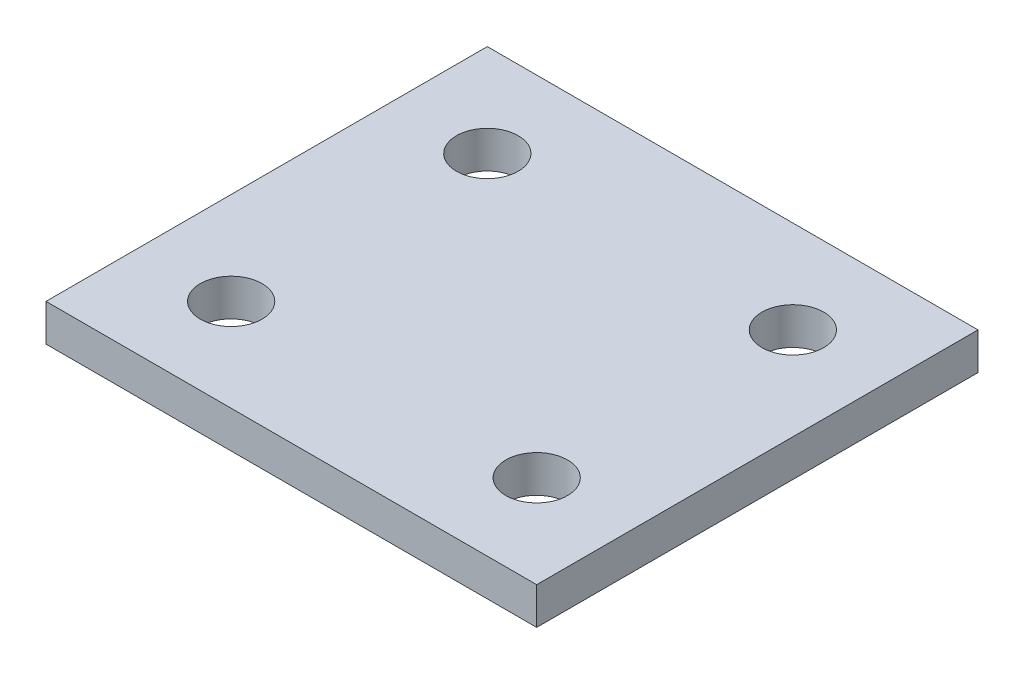
ISO-10303-21;
HEADER;
FILE_DESCRIPTION(('STEP AP214'),'2;1');
FILE_NAME('part.step','',(''),(''),'','','');
FILE_SCHEMA(('AUTOMOTIVE_DESIGN { 1 0 10303 214 1 1 1 1 }'));
ENDSEC;
DATA;
#1=APPLICATION_CONTEXT('core data for automotive mechanical design processes');
#2=APPLICATION_PROTOCOL_DEFINITION('international standard','automotive_design',2000,#1);
#3=PRODUCT_CONTEXT('',#1,'mechanical');
#4=PRODUCT('Part','Part','',(#3));
#5=PRODUCT_RELATED_PRODUCT_CATEGORY('part','',(#4));
#6=PRODUCT_DEFINITION_FORMATION('','',#4);
#7=PRODUCT_DEFINITION_CONTEXT('part definition',#1,'design');
#8=PRODUCT_DEFINITION('design','',#6,#7);
#9=PRODUCT_DEFINITION_SHAPE('','',#8);
#10=(LENGTH_UNIT() NAMED_UNIT(*) SI_UNIT(.MILLI.,.METRE.));
#11=(NAMED_UNIT(*) PLANE_ANGLE_UNIT() SI_UNIT($,.RADIAN.));
#12=(NAMED_UNIT(*) SI_UNIT($,.STERADIAN.) SOLID_ANGLE_UNIT());
#13=UNCERTAINTY_MEASURE_WITH_UNIT(LENGTH_MEASURE(1.E-05),#10,'distance_accuracy_value','');
#14=(GEOMETRIC_REPRESENTATION_CONTEXT(3) GLOBAL_UNCERTAINTY_ASSIGNED_CONTEXT((#13)) GLOBAL_UNIT_ASSIGNED_CONTEXT((#10,
#11,#12)) REPRESENTATION_CONTEXT('',''));
#15=CARTESIAN_POINT('',(0.,0.,0.));
#16=DIRECTION('',(0.,0.,1.));
#17=DIRECTION('',(1.,0.,0.));
#18=AXIS2_PLACEMENT_3D('',#15,#16,#17);
#19=CARTESIAN_POINT('',(0.,1.2,0.));
#20=DIRECTION('',(0.,-1.,0.));
#21=DIRECTION('',(0.,0.,-1.));
#22=AXIS2_PLACEMENT_3D('',#19,#20,#21);
#23=PLANE('',#22);
#24=CARTESIAN_POINT('',(12.9000000000001,1.2,11.3));
#25=DIRECTION('',(0.,1.,0.));
#26=DIRECTION('',(0.,0.,1.));
#27=AXIS2_PLACEMENT_3D('',#24,#25,#26);
#28=CIRCLE('',#27,0.999999999999998);
#29=CARTESIAN_POINT('',(12.9000000000001,1.2,12.3));
#30=VERTEX_POINT('',#29);
#31=EDGE_CURVE('E121',#30,#30,#28,.T.);
#32=ORIENTED_EDGE('',*,*,#31,.F.);
#33=EDGE_LOOP('',(#32));
#34=FACE_BOUND('',#33,.T.);
#35=CARTESIAN_POINT('',(3.,1.2,3.));
#36=DIRECTION('',(0.,1.,0.));
#37=DIRECTION('',(0.,0.,1.));
#38=AXIS2_PLACEMENT_3D('',#35,#36,#37);
#39=CIRCLE('',#38,1.);
#40=CARTESIAN_POINT('',(3.,1.2,4.));
#41=VERTEX_POINT('',#40);
#42=EDGE_CURVE('E100',#41,#41,#39,.T.);
#43=ORIENTED_EDGE('',*,*,#42,.F.);
#44=EDGE_LOOP('',(#43));
#45=FACE_BOUND('',#44,.T.);
#46=DIRECTION('',(0.,0.,1.));
#47=VECTOR('',#46,1.);
#48=CARTESIAN_POINT('',(0.,1.2,14.3));
#49=LINE('',#48,#47);
#50=CARTESIAN_POINT('',(0.,1.2,0.));
#51=VERTEX_POINT('',#50);
#52=CARTESIAN_POINT('',(0.,1.2,14.3));
#53=VERTEX_POINT('',#52);
#54=EDGE_CURVE('E85',#51,#53,#49,.T.);
#55=ORIENTED_EDGE('',*,*,#54,.T.);
#56=DIRECTION('',(1.,0.,0.));
#57=VECTOR('',#56,1.);
#58=CARTESIAN_POINT('',(15.9,1.2,14.3));
#59=LINE('',#58,#57);
#60=CARTESIAN_POINT('',(15.9,1.2,14.3));
#61=VERTEX_POINT('',#60);
#62=EDGE_CURVE('E80',#53,#61,#59,.T.);
#63=ORIENTED_EDGE('',*,*,#62,.T.);
#64=DIRECTION('',(0.,0.,-1.));
#65=VECTOR('',#64,1.);
#66=CARTESIAN_POINT('',(15.9,1.2,0.));
#67=LINE('',#66,#65);
#68=CARTESIAN_POINT('',(15.9,1.2,0.));
#69=VERTEX_POINT('',#68);
#70=EDGE_CURVE('E83',#61,#69,#67,.T.);
#71=ORIENTED_EDGE('',*,*,#70,.T.);
#72=DIRECTION('',(-1.,0.,0.));
#73=VECTOR('',#72,1.);
#74=CARTESIAN_POINT('',(0.,1.2,0.));
#75=LINE('',#74,#73);
#76=EDGE_CURVE('E50',#69,#51,#75,.T.);
#77=ORIENTED_EDGE('',*,*,#76,.T.);
#78=EDGE_LOOP('',(#55,#63,#71,#77));
#79=FACE_BOUND('',#78,.T.);
#80=CARTESIAN_POINT('',(12.9,1.2,3.));
#81=DIRECTION('',(0.,1.,0.));
#82=DIRECTION('',(0.,0.,1.));
#83=AXIS2_PLACEMENT_3D('',#80,#81,#82);
#84=CIRCLE('',#83,0.999999999999998);
#85=CARTESIAN_POINT('',(12.9,1.2,4.));
#86=VERTEX_POINT('',#85);
#87=EDGE_CURVE('E115',#86,#86,#84,.T.);
#88=ORIENTED_EDGE('',*,*,#87,.F.);
#89=EDGE_LOOP('',(#88));
#90=FACE_BOUND('',#89,.T.);
#91=CARTESIAN_POINT('',(3.00000000000009,1.2,11.3));
#92=DIRECTION('',(0.,1.,0.));
#93=DIRECTION('',(0.,0.,1.));
#94=AXIS2_PLACEMENT_3D('',#91,#92,#93);
#95=CIRCLE('',#94,1.);
#96=CARTESIAN_POINT('',(3.00000000000009,1.2,12.3));
#97=VERTEX_POINT('',#96);
#98=EDGE_CURVE('E127',#97,#97,#95,.T.);
#99=ORIENTED_EDGE('',*,*,#98,.F.);
#100=EDGE_LOOP('',(#99));
#101=FACE_BOUND('',#100,.T.);
#102=ADVANCED_FACE('F33',(#34,#45,#79,#90,#101),#23,.F.);
#103=CARTESIAN_POINT('',(0.,0.,0.));
#104=DIRECTION('',(0.,-1.,0.));
#105=DIRECTION('',(0.,0.,-1.));
#106=AXIS2_PLACEMENT_3D('',#103,#104,#105);
#107=PLANE('',#106);
#108=CARTESIAN_POINT('',(12.9000000000001,0.,11.3));
#109=DIRECTION('',(0.,1.,0.));
#110=DIRECTION('',(0.,0.,1.));
#111=AXIS2_PLACEMENT_3D('',#108,#109,#110);
#112=CIRCLE('',#111,0.999999999999998);
#113=CARTESIAN_POINT('',(12.9000000000001,0.,12.3));
#114=VERTEX_POINT('',#113);
#115=EDGE_CURVE('E124',#114,#114,#112,.T.);
#116=ORIENTED_EDGE('',*,*,#115,.T.);
#117=EDGE_LOOP('',(#116));
#118=FACE_BOUND('',#117,.T.);
#119=CARTESIAN_POINT('',(3.,0.,3.));
#120=DIRECTION('',(0.,1.,0.));
#121=DIRECTION('',(0.,0.,1.));
#122=AXIS2_PLACEMENT_3D('',#119,#120,#121);
#123=CIRCLE('',#122,1.);
#124=CARTESIAN_POINT('',(3.,0.,4.));
#125=VERTEX_POINT('',#124);
#126=EDGE_CURVE('E112',#125,#125,#123,.T.);
#127=ORIENTED_EDGE('',*,*,#126,.T.);
#128=EDGE_LOOP('',(#127));
#129=FACE_BOUND('',#128,.T.);
#130=DIRECTION('',(0.,0.,1.));
#131=VECTOR('',#130,1.);
#132=CARTESIAN_POINT('',(0.,0.,14.3));
#133=LINE('',#132,#131);
#134=CARTESIAN_POINT('',(0.,0.,0.));
#135=VERTEX_POINT('',#134);
#136=CARTESIAN_POINT('',(0.,0.,14.3));
#137=VERTEX_POINT('',#136);
#138=EDGE_CURVE('E97',#135,#137,#133,.T.);
#139=ORIENTED_EDGE('',*,*,#138,.F.);
#140=DIRECTION('',(-1.,0.,0.));
#141=VECTOR('',#140,1.);
#142=CARTESIAN_POINT('',(0.,0.,0.));
#143=LINE('',#142,#141);
#144=CARTESIAN_POINT('',(15.9,0.,0.));
#145=VERTEX_POINT('',#144);
#146=EDGE_CURVE('E73',#145,#135,#143,.T.);
#147=ORIENTED_EDGE('',*,*,#146,.F.);
#148=DIRECTION('',(0.,0.,-1.));
#149=VECTOR('',#148,1.);
#150=CARTESIAN_POINT('',(15.9,0.,0.));
#151=LINE('',#150,#149);
#152=CARTESIAN_POINT('',(15.9,0.,14.3));
#153=VERTEX_POINT('',#152);
#154=EDGE_CURVE('E67',#153,#145,#151,.T.);
#155=ORIENTED_EDGE('',*,*,#154,.F.);
#156=DIRECTION('',(1.,0.,0.));
#157=VECTOR('',#156,1.);
#158=CARTESIAN_POINT('',(15.9,0.,14.3));
#159=LINE('',#158,#157);
#160=EDGE_CURVE('E89',#137,#153,#159,.T.);
#161=ORIENTED_EDGE('',*,*,#160,.F.);
#162=EDGE_LOOP('',(#139,#147,#155,#161));
#163=FACE_BOUND('',#162,.T.);
#164=CARTESIAN_POINT('',(12.9,0.,3.));
#165=DIRECTION('',(0.,1.,0.));
#166=DIRECTION('',(0.,0.,1.));
#167=AXIS2_PLACEMENT_3D('',#164,#165,#166);
#168=CIRCLE('',#167,0.999999999999998);
#169=CARTESIAN_POINT('',(12.9,0.,4.));
#170=VERTEX_POINT('',#169);
#171=EDGE_CURVE('E118',#170,#170,#168,.T.);
#172=ORIENTED_EDGE('',*,*,#171,.T.);
#173=EDGE_LOOP('',(#172));
#174=FACE_BOUND('',#173,.T.);
#175=CARTESIAN_POINT('',(3.00000000000009,0.,11.3));
#176=DIRECTION('',(0.,1.,0.));
#177=DIRECTION('',(0.,0.,1.));
#178=AXIS2_PLACEMENT_3D('',#175,#176,#177);
#179=CIRCLE('',#178,1.);
#180=CARTESIAN_POINT('',(3.00000000000009,0.,12.3));
#181=VERTEX_POINT('',#180);
#182=EDGE_CURVE('E130',#181,#181,#179,.T.);
#183=ORIENTED_EDGE('',*,*,#182,.T.);
#184=EDGE_LOOP('',(#183));
#185=FACE_BOUND('',#184,.T.);
#186=ADVANCED_FACE('F108',(#118,#129,#163,#174,#185),#107,.T.);
#187=CARTESIAN_POINT('',(0.,1.2,14.3));
#188=DIRECTION('',(1.,0.,0.));
#189=DIRECTION('',(0.,0.,-1.));
#190=AXIS2_PLACEMENT_3D('',#187,#188,#189);
#191=PLANE('',#190);
#192=ORIENTED_EDGE('',*,*,#138,.T.);
#193=DIRECTION('',(0.,-1.,0.));
#194=VECTOR('',#193,1.);
#195=CARTESIAN_POINT('',(0.,1.2,14.3));
#196=LINE('',#195,#194);
#197=EDGE_CURVE('E11',#53,#137,#196,.T.);
#198=ORIENTED_EDGE('',*,*,#197,.F.);
#199=ORIENTED_EDGE('',*,*,#54,.F.);
#200=DIRECTION('',(0.,-1.,0.));
#201=VECTOR('',#200,1.);
#202=CARTESIAN_POINT('',(0.,1.2,0.));
#203=LINE('',#202,#201);
#204=EDGE_CURVE('E93',#51,#135,#203,.T.);
#205=ORIENTED_EDGE('',*,*,#204,.T.);
#206=EDGE_LOOP('',(#192,#198,#199,#205));
#207=FACE_BOUND('',#206,.T.);
#208=ADVANCED_FACE('F35',(#207),#191,.F.);
#209=CARTESIAN_POINT('',(15.9,1.2,14.3));
#210=DIRECTION('',(0.,0.,-1.));
#211=DIRECTION('',(-1.,0.,0.));
#212=AXIS2_PLACEMENT_3D('',#209,#210,#211);
#213=PLANE('',#212);
#214=ORIENTED_EDGE('',*,*,#160,.T.);
#215=DIRECTION('',(0.,-1.,0.));
#216=VECTOR('',#215,1.);
#217=CARTESIAN_POINT('',(15.9,1.2,14.3));
#218=LINE('',#217,#216);
#219=EDGE_CURVE('E42',#61,#153,#218,.T.);
#220=ORIENTED_EDGE('',*,*,#219,.F.);
#221=ORIENTED_EDGE('',*,*,#62,.F.);
#222=ORIENTED_EDGE('',*,*,#197,.T.);
#223=EDGE_LOOP('',(#214,#220,#221,#222));
#224=FACE_BOUND('',#223,.T.);
#225=ADVANCED_FACE('F88',(#224),#213,.F.);
#226=CARTESIAN_POINT('',(15.9,1.2,0.));
#227=DIRECTION('',(-1.,0.,0.));
#228=DIRECTION('',(0.,0.,1.));
#229=AXIS2_PLACEMENT_3D('',#226,#227,#228);
#230=PLANE('',#229);
#231=ORIENTED_EDGE('',*,*,#154,.T.);
#232=DIRECTION('',(0.,-1.,0.));
#233=VECTOR('',#232,1.);
#234=CARTESIAN_POINT('',(15.9,1.2,0.));
#235=LINE('',#234,#233);
#236=EDGE_CURVE('E90',#69,#145,#235,.T.);
#237=ORIENTED_EDGE('',*,*,#236,.F.);
#238=ORIENTED_EDGE('',*,*,#70,.F.);
#239=ORIENTED_EDGE('',*,*,#219,.T.);
#240=EDGE_LOOP('',(#231,#237,#238,#239));
#241=FACE_BOUND('',#240,.T.);
#242=ADVANCED_FACE('F91',(#241),#230,.F.);
#243=CARTESIAN_POINT('',(0.,1.2,0.));
#244=DIRECTION('',(0.,0.,1.));
#245=DIRECTION('',(1.,0.,0.));
#246=AXIS2_PLACEMENT_3D('',#243,#244,#245);
#247=PLANE('',#246);
#248=ORIENTED_EDGE('',*,*,#146,.T.);
#249=ORIENTED_EDGE('',*,*,#204,.F.);
#250=ORIENTED_EDGE('',*,*,#76,.F.);
#251=ORIENTED_EDGE('',*,*,#236,.T.);
#252=EDGE_LOOP('',(#248,#249,#250,#251));
#253=FACE_BOUND('',#252,.T.);
#254=ADVANCED_FACE('F105',(#253),#247,.F.);
#255=CARTESIAN_POINT('',(3.,1.2,3.));
#256=DIRECTION('',(0.,-1.,0.));
#257=DIRECTION('',(0.,0.,-1.));
#258=AXIS2_PLACEMENT_3D('',#255,#256,#257);
#259=CYLINDRICAL_SURFACE('',#258,1.);
#260=ORIENTED_EDGE('',*,*,#42,.T.);
#261=EDGE_LOOP('',(#260));
#262=FACE_BOUND('',#261,.T.);
#263=ORIENTED_EDGE('',*,*,#126,.F.);
#264=EDGE_LOOP('',(#263));
#265=FACE_BOUND('',#264,.T.);
#266=ADVANCED_FACE('F150',(#262,#265),#259,.F.);
#267=CARTESIAN_POINT('',(12.9,1.2,3.));
#268=DIRECTION('',(0.,-1.,0.));
#269=DIRECTION('',(0.,0.,-1.));
#270=AXIS2_PLACEMENT_3D('',#267,#268,#269);
#271=CYLINDRICAL_SURFACE('',#270,0.999999999999998);
#272=ORIENTED_EDGE('',*,*,#87,.T.);
#273=EDGE_LOOP('',(#272));
#274=FACE_BOUND('',#273,.T.);
#275=ORIENTED_EDGE('',*,*,#171,.F.);
#276=EDGE_LOOP('',(#275));
#277=FACE_BOUND('',#276,.T.);
#278=ADVANCED_FACE('F196',(#274,#277),#271,.F.);
#279=CARTESIAN_POINT('',(12.9000000000001,1.2,11.3));
#280=DIRECTION('',(0.,-1.,0.));
#281=DIRECTION('',(0.,0.,-1.));
#282=AXIS2_PLACEMENT_3D('',#279,#280,#281);
#283=CYLINDRICAL_SURFACE('',#282,0.999999999999998);
#284=ORIENTED_EDGE('',*,*,#31,.T.);
#285=EDGE_LOOP('',(#284));
#286=FACE_BOUND('',#285,.T.);
#287=ORIENTED_EDGE('',*,*,#115,.F.);
#288=EDGE_LOOP('',(#287));
#289=FACE_BOUND('',#288,.T.);
#290=ADVANCED_FACE('F204',(#286,#289),#283,.F.);
#291=CARTESIAN_POINT('',(3.00000000000009,1.2,11.3));
#292=DIRECTION('',(0.,-1.,0.));
#293=DIRECTION('',(0.,0.,-1.));
#294=AXIS2_PLACEMENT_3D('',#291,#292,#293);
#295=CYLINDRICAL_SURFACE('',#294,1.);
#296=ORIENTED_EDGE('',*,*,#98,.T.);
#297=EDGE_LOOP('',(#296));
#298=FACE_BOUND('',#297,.T.);
#299=ORIENTED_EDGE('',*,*,#182,.F.);
#300=EDGE_LOOP('',(#299));
#301=FACE_BOUND('',#300,.T.);
#302=ADVANCED_FACE('F136',(#298,#301),#295,.F.);
#303=CLOSED_SHELL('',(#102,#186,#208,#225,#242,#254,#266,#278,#290,#302));
#304=MANIFOLD_SOLID_BREP('B2',#303);
#305=ADVANCED_BREP_SHAPE_REPRESENTATION('',(#18,#304),#14);
#306=SHAPE_DEFINITION_REPRESENTATION(#9,#305);
ENDSEC;
END-ISO-10303-21;
